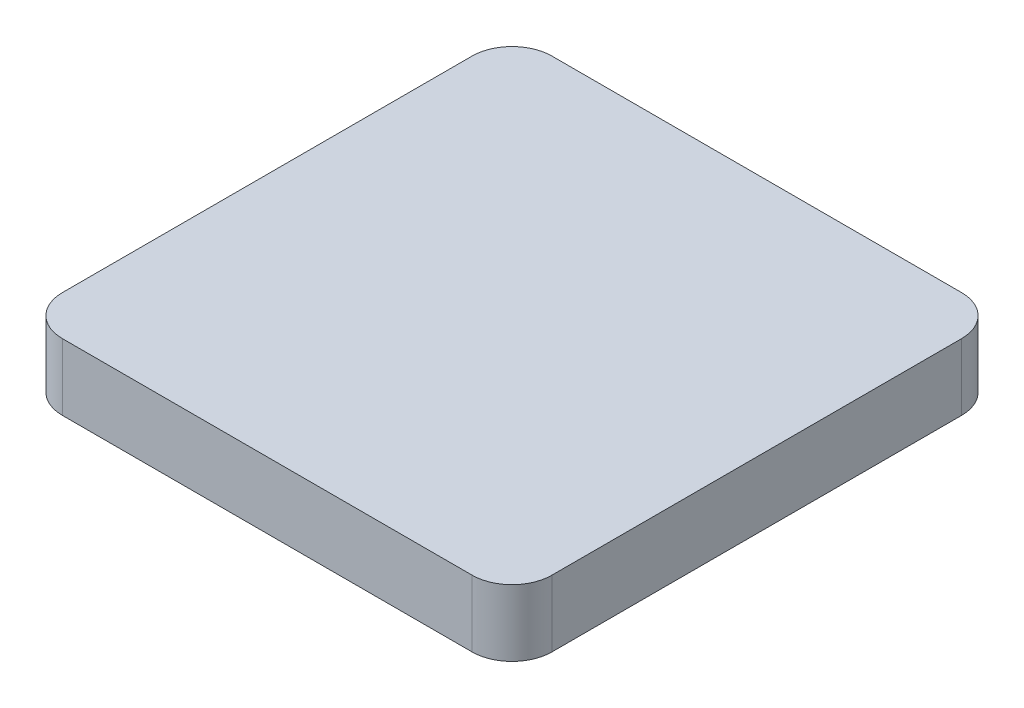
ISO-10303-21;
HEADER;
FILE_DESCRIPTION(('STEP AP214'),'2;1');
FILE_NAME('part.step','',(''),(''),'','','');
FILE_SCHEMA(('AUTOMOTIVE_DESIGN { 1 0 10303 214 1 1 1 1 }'));
ENDSEC;
DATA;
#1=APPLICATION_CONTEXT('core data for automotive mechanical design processes');
#2=APPLICATION_PROTOCOL_DEFINITION('international standard','automotive_design',2000,#1);
#3=PRODUCT_CONTEXT('',#1,'mechanical');
#4=PRODUCT('Part','Part','',(#3));
#5=PRODUCT_RELATED_PRODUCT_CATEGORY('part','',(#4));
#6=PRODUCT_DEFINITION_FORMATION('','',#4);
#7=PRODUCT_DEFINITION_CONTEXT('part definition',#1,'design');
#8=PRODUCT_DEFINITION('design','',#6,#7);
#9=PRODUCT_DEFINITION_SHAPE('','',#8);
#10=(LENGTH_UNIT() NAMED_UNIT(*) SI_UNIT(.MILLI.,.METRE.));
#11=(NAMED_UNIT(*) PLANE_ANGLE_UNIT() SI_UNIT($,.RADIAN.));
#12=(NAMED_UNIT(*) SI_UNIT($,.STERADIAN.) SOLID_ANGLE_UNIT());
#13=UNCERTAINTY_MEASURE_WITH_UNIT(LENGTH_MEASURE(1.E-05),#10,'distance_accuracy_value','');
#14=(GEOMETRIC_REPRESENTATION_CONTEXT(3) GLOBAL_UNCERTAINTY_ASSIGNED_CONTEXT((#13)) GLOBAL_UNIT_ASSIGNED_CONTEXT((#10,
#11,#12)) REPRESENTATION_CONTEXT('',''));
#15=CARTESIAN_POINT('',(0.,0.,0.));
#16=DIRECTION('',(0.,0.,1.));
#17=DIRECTION('',(1.,0.,0.));
#18=AXIS2_PLACEMENT_3D('',#15,#16,#17);
#19=CARTESIAN_POINT('',(-1195.4,1570.,-895.4));
#20=DIRECTION('',(0.,-1.,0.));
#21=DIRECTION('',(0.,0.,-1.));
#22=AXIS2_PLACEMENT_3D('',#19,#20,#21);
#23=PLANE('',#22);
#24=DIRECTION('',(0.,0.,1.));
#25=VECTOR('',#24,1.);
#26=CARTESIAN_POINT('',(-1198.4,1570.,-898.4));
#27=LINE('',#26,#25);
#28=CARTESIAN_POINT('',(-1198.4,1570.,-864.6));
#29=VERTEX_POINT('',#28);
#30=CARTESIAN_POINT('',(-1198.4,1570.,-895.4));
#31=VERTEX_POINT('',#30);
#32=EDGE_CURVE('E103',#29,#31,#27,.F.);
#33=ORIENTED_EDGE('',*,*,#32,.F.);
#34=CARTESIAN_POINT('',(-1195.4,1570.,-864.6));
#35=DIRECTION('',(0.,1.,0.));
#36=DIRECTION('',(0.,0.,1.));
#37=AXIS2_PLACEMENT_3D('',#34,#35,#36);
#38=CIRCLE('',#37,3.);
#39=CARTESIAN_POINT('',(-1195.4,1570.,-861.6));
#40=VERTEX_POINT('',#39);
#41=EDGE_CURVE('E151',#40,#29,#38,.F.);
#42=ORIENTED_EDGE('',*,*,#41,.F.);
#43=DIRECTION('',(1.,0.,0.));
#44=VECTOR('',#43,1.);
#45=CARTESIAN_POINT('',(-1198.4,1570.,-861.6));
#46=LINE('',#45,#44);
#47=CARTESIAN_POINT('',(-1164.6,1570.,-861.6));
#48=VERTEX_POINT('',#47);
#49=EDGE_CURVE('E133',#48,#40,#46,.F.);
#50=ORIENTED_EDGE('',*,*,#49,.F.);
#51=CARTESIAN_POINT('',(-1164.6,1570.,-864.6));
#52=DIRECTION('',(0.,1.,0.));
#53=DIRECTION('',(0.,0.,1.));
#54=AXIS2_PLACEMENT_3D('',#51,#52,#53);
#55=CIRCLE('',#54,3.);
#56=CARTESIAN_POINT('',(-1161.6,1570.,-864.6));
#57=VERTEX_POINT('',#56);
#58=EDGE_CURVE('E155',#57,#48,#55,.F.);
#59=ORIENTED_EDGE('',*,*,#58,.F.);
#60=DIRECTION('',(0.,0.,-1.));
#61=VECTOR('',#60,1.);
#62=CARTESIAN_POINT('',(-1161.6,1570.,-861.6));
#63=LINE('',#62,#61);
#64=CARTESIAN_POINT('',(-1161.6,1570.,-895.4));
#65=VERTEX_POINT('',#64);
#66=EDGE_CURVE('E136',#65,#57,#63,.F.);
#67=ORIENTED_EDGE('',*,*,#66,.F.);
#68=CARTESIAN_POINT('',(-1164.6,1570.,-895.4));
#69=DIRECTION('',(0.,1.,0.));
#70=DIRECTION('',(0.,0.,1.));
#71=AXIS2_PLACEMENT_3D('',#68,#69,#70);
#72=CIRCLE('',#71,3.);
#73=CARTESIAN_POINT('',(-1164.6,1570.,-898.4));
#74=VERTEX_POINT('',#73);
#75=EDGE_CURVE('E119',#74,#65,#72,.F.);
#76=ORIENTED_EDGE('',*,*,#75,.F.);
#77=DIRECTION('',(1.,0.,0.));
#78=VECTOR('',#77,1.);
#79=CARTESIAN_POINT('',(-1161.6,1570.,-898.4));
#80=LINE('',#79,#78);
#81=CARTESIAN_POINT('',(-1195.4,1570.,-898.4));
#82=VERTEX_POINT('',#81);
#83=EDGE_CURVE('E117',#82,#74,#80,.T.);
#84=ORIENTED_EDGE('',*,*,#83,.F.);
#85=CARTESIAN_POINT('',(-1195.4,1570.,-895.4));
#86=DIRECTION('',(0.,1.,0.));
#87=DIRECTION('',(0.,0.,1.));
#88=AXIS2_PLACEMENT_3D('',#85,#86,#87);
#89=CIRCLE('',#88,3.);
#90=EDGE_CURVE('E45',#31,#82,#89,.F.);
#91=ORIENTED_EDGE('',*,*,#90,.F.);
#92=EDGE_LOOP('',(#33,#42,#50,#59,#67,#76,#84,#91));
#93=FACE_BOUND('',#92,.T.);
#94=ADVANCED_FACE('F42',(#93),#23,.F.);
#95=CARTESIAN_POINT('',(-1198.4,1565.,-898.4));
#96=DIRECTION('',(-1.,0.,0.));
#97=DIRECTION('',(0.,0.,1.));
#98=AXIS2_PLACEMENT_3D('',#95,#96,#97);
#99=PLANE('',#98);
#100=ORIENTED_EDGE('',*,*,#32,.T.);
#101=DIRECTION('',(0.,1.,0.));
#102=VECTOR('',#101,1.);
#103=CARTESIAN_POINT('',(-1198.4,1565.,-895.4));
#104=LINE('',#103,#102);
#105=CARTESIAN_POINT('',(-1198.4,1565.,-895.4));
#106=VERTEX_POINT('',#105);
#107=EDGE_CURVE('E114',#106,#31,#104,.T.);
#108=ORIENTED_EDGE('',*,*,#107,.F.);
#109=DIRECTION('',(0.,0.,-1.));
#110=VECTOR('',#109,1.);
#111=CARTESIAN_POINT('',(-1198.4,1565.,-895.4));
#112=LINE('',#111,#110);
#113=CARTESIAN_POINT('',(-1198.4,1565.,-864.6));
#114=VERTEX_POINT('',#113);
#115=EDGE_CURVE('E150',#114,#106,#112,.T.);
#116=ORIENTED_EDGE('',*,*,#115,.F.);
#117=DIRECTION('',(0.,1.,0.));
#118=VECTOR('',#117,1.);
#119=CARTESIAN_POINT('',(-1198.4,1565.,-864.6));
#120=LINE('',#119,#118);
#121=EDGE_CURVE('E154',#29,#114,#120,.F.);
#122=ORIENTED_EDGE('',*,*,#121,.F.);
#123=EDGE_LOOP('',(#100,#108,#116,#122));
#124=FACE_BOUND('',#123,.T.);
#125=ADVANCED_FACE('F188',(#124),#99,.T.);
#126=CARTESIAN_POINT('',(-1195.4,1565.,-895.4));
#127=DIRECTION('',(0.,1.,0.));
#128=DIRECTION('',(0.,0.,1.));
#129=AXIS2_PLACEMENT_3D('',#126,#127,#128);
#130=CYLINDRICAL_SURFACE('',#129,3.);
#131=ORIENTED_EDGE('',*,*,#90,.T.);
#132=DIRECTION('',(0.,1.,0.));
#133=VECTOR('',#132,1.);
#134=CARTESIAN_POINT('',(-1195.4,1565.,-898.4));
#135=LINE('',#134,#133);
#136=CARTESIAN_POINT('',(-1195.4,1565.,-898.4));
#137=VERTEX_POINT('',#136);
#138=EDGE_CURVE('E112',#137,#82,#135,.T.);
#139=ORIENTED_EDGE('',*,*,#138,.F.);
#140=CARTESIAN_POINT('',(-1195.4,1565.,-895.4));
#141=DIRECTION('',(0.,1.,0.));
#142=DIRECTION('',(0.,0.,1.));
#143=AXIS2_PLACEMENT_3D('',#140,#141,#142);
#144=CIRCLE('',#143,3.);
#145=EDGE_CURVE('E148',#106,#137,#144,.F.);
#146=ORIENTED_EDGE('',*,*,#145,.F.);
#147=ORIENTED_EDGE('',*,*,#107,.T.);
#148=EDGE_LOOP('',(#131,#139,#146,#147));
#149=FACE_BOUND('',#148,.T.);
#150=ADVANCED_FACE('F109',(#149),#130,.T.);
#151=CARTESIAN_POINT('',(-1161.6,1565.,-898.4));
#152=DIRECTION('',(0.,0.,-1.));
#153=DIRECTION('',(0.,1.,0.));
#154=AXIS2_PLACEMENT_3D('',#151,#152,#153);
#155=PLANE('',#154);
#156=ORIENTED_EDGE('',*,*,#83,.T.);
#157=DIRECTION('',(0.,1.,0.));
#158=VECTOR('',#157,1.);
#159=CARTESIAN_POINT('',(-1164.6,1565.,-898.4));
#160=LINE('',#159,#158);
#161=CARTESIAN_POINT('',(-1164.6,1565.,-898.4));
#162=VERTEX_POINT('',#161);
#163=EDGE_CURVE('E122',#162,#74,#160,.T.);
#164=ORIENTED_EDGE('',*,*,#163,.F.);
#165=DIRECTION('',(1.,0.,0.));
#166=VECTOR('',#165,1.);
#167=CARTESIAN_POINT('',(-1195.4,1565.,-898.4));
#168=LINE('',#167,#166);
#169=EDGE_CURVE('E125',#137,#162,#168,.T.);
#170=ORIENTED_EDGE('',*,*,#169,.F.);
#171=ORIENTED_EDGE('',*,*,#138,.T.);
#172=EDGE_LOOP('',(#156,#164,#170,#171));
#173=FACE_BOUND('',#172,.T.);
#174=ADVANCED_FACE('F123',(#173),#155,.T.);
#175=CARTESIAN_POINT('',(-1164.6,1565.,-895.4));
#176=DIRECTION('',(0.,1.,0.));
#177=DIRECTION('',(0.,0.,1.));
#178=AXIS2_PLACEMENT_3D('',#175,#176,#177);
#179=CYLINDRICAL_SURFACE('',#178,3.);
#180=ORIENTED_EDGE('',*,*,#75,.T.);
#181=DIRECTION('',(0.,1.,0.));
#182=VECTOR('',#181,1.);
#183=CARTESIAN_POINT('',(-1161.6,1565.,-895.4));
#184=LINE('',#183,#182);
#185=CARTESIAN_POINT('',(-1161.6,1565.,-895.4));
#186=VERTEX_POINT('',#185);
#187=EDGE_CURVE('E138',#186,#65,#184,.T.);
#188=ORIENTED_EDGE('',*,*,#187,.F.);
#189=CARTESIAN_POINT('',(-1164.6,1565.,-895.4));
#190=DIRECTION('',(0.,1.,0.));
#191=DIRECTION('',(0.,0.,1.));
#192=AXIS2_PLACEMENT_3D('',#189,#190,#191);
#193=CIRCLE('',#192,3.);
#194=EDGE_CURVE('E145',#162,#186,#193,.F.);
#195=ORIENTED_EDGE('',*,*,#194,.F.);
#196=ORIENTED_EDGE('',*,*,#163,.T.);
#197=EDGE_LOOP('',(#180,#188,#195,#196));
#198=FACE_BOUND('',#197,.T.);
#199=ADVANCED_FACE('F159',(#198),#179,.T.);
#200=CARTESIAN_POINT('',(-1161.6,1565.,-861.6));
#201=DIRECTION('',(1.,0.,0.));
#202=DIRECTION('',(0.,0.,-1.));
#203=AXIS2_PLACEMENT_3D('',#200,#201,#202);
#204=PLANE('',#203);
#205=ORIENTED_EDGE('',*,*,#66,.T.);
#206=DIRECTION('',(0.,1.,0.));
#207=VECTOR('',#206,1.);
#208=CARTESIAN_POINT('',(-1161.6,1565.,-864.6));
#209=LINE('',#208,#207);
#210=CARTESIAN_POINT('',(-1161.6,1565.,-864.6));
#211=VERTEX_POINT('',#210);
#212=EDGE_CURVE('E137',#211,#57,#209,.T.);
#213=ORIENTED_EDGE('',*,*,#212,.F.);
#214=DIRECTION('',(0.,0.,-1.));
#215=VECTOR('',#214,1.);
#216=CARTESIAN_POINT('',(-1161.6,1565.,-895.4));
#217=LINE('',#216,#215);
#218=EDGE_CURVE('E144',#186,#211,#217,.F.);
#219=ORIENTED_EDGE('',*,*,#218,.F.);
#220=ORIENTED_EDGE('',*,*,#187,.T.);
#221=EDGE_LOOP('',(#205,#213,#219,#220));
#222=FACE_BOUND('',#221,.T.);
#223=ADVANCED_FACE('F183',(#222),#204,.T.);
#224=CARTESIAN_POINT('',(-1164.6,1565.,-864.6));
#225=DIRECTION('',(0.,1.,0.));
#226=DIRECTION('',(0.,0.,1.));
#227=AXIS2_PLACEMENT_3D('',#224,#225,#226);
#228=CYLINDRICAL_SURFACE('',#227,3.);
#229=ORIENTED_EDGE('',*,*,#58,.T.);
#230=DIRECTION('',(0.,-1.,0.));
#231=VECTOR('',#230,1.);
#232=CARTESIAN_POINT('',(-1164.6,1565.,-861.6));
#233=LINE('',#232,#231);
#234=CARTESIAN_POINT('',(-1164.6,1565.,-861.6));
#235=VERTEX_POINT('',#234);
#236=EDGE_CURVE('E135',#235,#48,#233,.F.);
#237=ORIENTED_EDGE('',*,*,#236,.F.);
#238=CARTESIAN_POINT('',(-1164.6,1565.,-864.6));
#239=DIRECTION('',(0.,1.,0.));
#240=DIRECTION('',(0.,0.,1.));
#241=AXIS2_PLACEMENT_3D('',#238,#239,#240);
#242=CIRCLE('',#241,3.);
#243=EDGE_CURVE('E141',#211,#235,#242,.F.);
#244=ORIENTED_EDGE('',*,*,#243,.F.);
#245=ORIENTED_EDGE('',*,*,#212,.T.);
#246=EDGE_LOOP('',(#229,#237,#244,#245));
#247=FACE_BOUND('',#246,.T.);
#248=ADVANCED_FACE('F179',(#247),#228,.T.);
#249=CARTESIAN_POINT('',(-1198.4,1565.,-861.6));
#250=DIRECTION('',(0.,0.,1.));
#251=DIRECTION('',(0.,-1.,0.));
#252=AXIS2_PLACEMENT_3D('',#249,#250,#251);
#253=PLANE('',#252);
#254=ORIENTED_EDGE('',*,*,#49,.T.);
#255=DIRECTION('',(0.,1.,0.));
#256=VECTOR('',#255,1.);
#257=CARTESIAN_POINT('',(-1195.4,1565.,-861.6));
#258=LINE('',#257,#256);
#259=CARTESIAN_POINT('',(-1195.4,1565.,-861.6));
#260=VERTEX_POINT('',#259);
#261=EDGE_CURVE('E60',#260,#40,#258,.T.);
#262=ORIENTED_EDGE('',*,*,#261,.F.);
#263=DIRECTION('',(1.,0.,0.));
#264=VECTOR('',#263,1.);
#265=CARTESIAN_POINT('',(-1195.4,1565.,-861.6));
#266=LINE('',#265,#264);
#267=EDGE_CURVE('E51',#235,#260,#266,.F.);
#268=ORIENTED_EDGE('',*,*,#267,.F.);
#269=ORIENTED_EDGE('',*,*,#236,.T.);
#270=EDGE_LOOP('',(#254,#262,#268,#269));
#271=FACE_BOUND('',#270,.T.);
#272=ADVANCED_FACE('F185',(#271),#253,.T.);
#273=CARTESIAN_POINT('',(-1195.4,1565.,-864.6));
#274=DIRECTION('',(0.,1.,0.));
#275=DIRECTION('',(0.,0.,1.));
#276=AXIS2_PLACEMENT_3D('',#273,#274,#275);
#277=CYLINDRICAL_SURFACE('',#276,3.);
#278=ORIENTED_EDGE('',*,*,#41,.T.);
#279=ORIENTED_EDGE('',*,*,#121,.T.);
#280=CARTESIAN_POINT('',(-1195.4,1565.,-864.6));
#281=DIRECTION('',(0.,1.,0.));
#282=DIRECTION('',(0.,0.,1.));
#283=AXIS2_PLACEMENT_3D('',#280,#281,#282);
#284=CIRCLE('',#283,3.);
#285=EDGE_CURVE('E12',#260,#114,#284,.F.);
#286=ORIENTED_EDGE('',*,*,#285,.F.);
#287=ORIENTED_EDGE('',*,*,#261,.T.);
#288=EDGE_LOOP('',(#278,#279,#286,#287));
#289=FACE_BOUND('',#288,.T.);
#290=ADVANCED_FACE('F187',(#289),#277,.T.);
#291=CARTESIAN_POINT('',(-1195.4,1565.,-895.4));
#292=DIRECTION('',(0.,-1.,0.));
#293=DIRECTION('',(0.,0.,-1.));
#294=AXIS2_PLACEMENT_3D('',#291,#292,#293);
#295=PLANE('',#294);
#296=ORIENTED_EDGE('',*,*,#267,.T.);
#297=ORIENTED_EDGE('',*,*,#285,.T.);
#298=ORIENTED_EDGE('',*,*,#115,.T.);
#299=ORIENTED_EDGE('',*,*,#145,.T.);
#300=ORIENTED_EDGE('',*,*,#169,.T.);
#301=ORIENTED_EDGE('',*,*,#194,.T.);
#302=ORIENTED_EDGE('',*,*,#218,.T.);
#303=ORIENTED_EDGE('',*,*,#243,.T.);
#304=EDGE_LOOP('',(#296,#297,#298,#299,#300,#301,#302,#303));
#305=FACE_BOUND('',#304,.T.);
#306=ADVANCED_FACE('F164',(#305),#295,.T.);
#307=CLOSED_SHELL('',(#94,#125,#150,#174,#199,#223,#248,#272,#290,#306));
#308=MANIFOLD_SOLID_BREP('B2',#307);
#309=ADVANCED_BREP_SHAPE_REPRESENTATION('',(#18,#308),#14);
#310=SHAPE_DEFINITION_REPRESENTATION(#9,#309);
ENDSEC;
END-ISO-10303-21;
